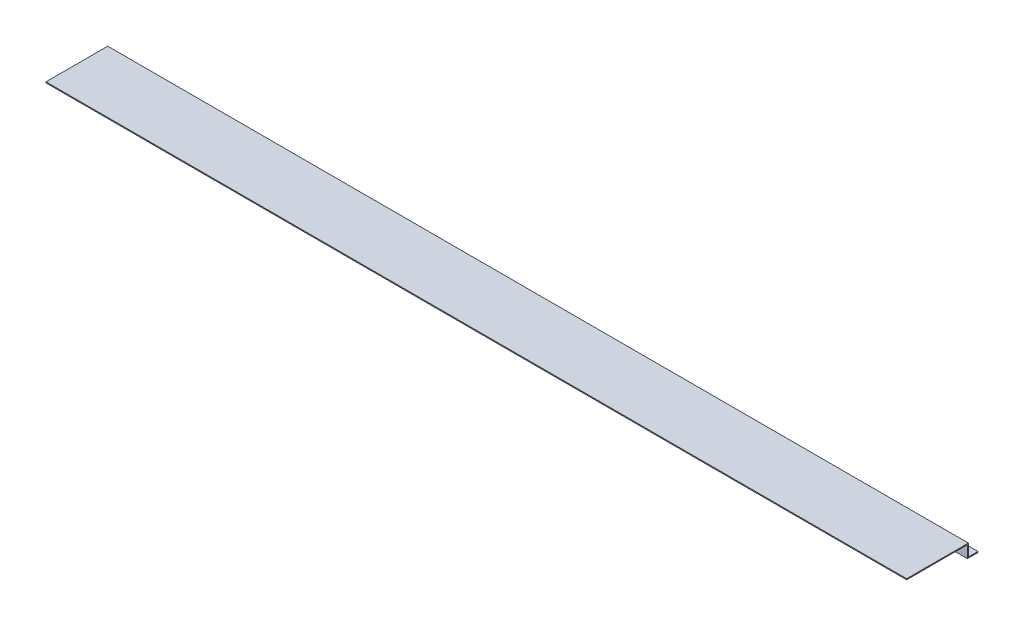
ISO-10303-21;
HEADER;
FILE_DESCRIPTION(('STEP AP214'),'2;1');
FILE_NAME('part.step','',(''),(''),'','','');
FILE_SCHEMA(('AUTOMOTIVE_DESIGN { 1 0 10303 214 1 1 1 1 }'));
ENDSEC;
DATA;
#1=APPLICATION_CONTEXT('core data for automotive mechanical design processes');
#2=APPLICATION_PROTOCOL_DEFINITION('international standard','automotive_design',2000,#1);
#3=PRODUCT_CONTEXT('',#1,'mechanical');
#4=PRODUCT('Part','Part','',(#3));
#5=PRODUCT_RELATED_PRODUCT_CATEGORY('part','',(#4));
#6=PRODUCT_DEFINITION_FORMATION('','',#4);
#7=PRODUCT_DEFINITION_CONTEXT('part definition',#1,'design');
#8=PRODUCT_DEFINITION('design','',#6,#7);
#9=PRODUCT_DEFINITION_SHAPE('','',#8);
#10=(LENGTH_UNIT() NAMED_UNIT(*) SI_UNIT(.MILLI.,.METRE.));
#11=(NAMED_UNIT(*) PLANE_ANGLE_UNIT() SI_UNIT($,.RADIAN.));
#12=(NAMED_UNIT(*) SI_UNIT($,.STERADIAN.) SOLID_ANGLE_UNIT());
#13=UNCERTAINTY_MEASURE_WITH_UNIT(LENGTH_MEASURE(1.E-05),#10,'distance_accuracy_value','');
#14=(GEOMETRIC_REPRESENTATION_CONTEXT(3) GLOBAL_UNCERTAINTY_ASSIGNED_CONTEXT((#13)) GLOBAL_UNIT_ASSIGNED_CONTEXT((#10,
#11,#12)) REPRESENTATION_CONTEXT('',''));
#15=CARTESIAN_POINT('',(0.,0.,0.));
#16=DIRECTION('',(0.,0.,1.));
#17=DIRECTION('',(1.,0.,0.));
#18=AXIS2_PLACEMENT_3D('',#15,#16,#17);
#19=CARTESIAN_POINT('',(1785.,0.,0.));
#20=DIRECTION('',(0.,0.,-1.));
#21=DIRECTION('',(-1.,0.,0.));
#22=AXIS2_PLACEMENT_3D('',#19,#20,#21);
#23=PLANE('',#22);
#24=DIRECTION('',(0.,-1.,0.));
#25=VECTOR('',#24,1.);
#26=CARTESIAN_POINT('',(0.,0.,0.));
#27=LINE('',#26,#25);
#28=CARTESIAN_POINT('',(0.,0.,0.));
#29=VERTEX_POINT('',#28);
#30=CARTESIAN_POINT('',(0.,-2.,0.));
#31=VERTEX_POINT('',#30);
#32=EDGE_CURVE('E134',#29,#31,#27,.T.);
#33=ORIENTED_EDGE('',*,*,#32,.T.);
#34=DIRECTION('',(-1.,0.,0.));
#35=VECTOR('',#34,1.);
#36=CARTESIAN_POINT('',(1785.,-2.,0.));
#37=LINE('',#36,#35);
#38=CARTESIAN_POINT('',(1785.,-2.,0.));
#39=VERTEX_POINT('',#38);
#40=EDGE_CURVE('E11',#39,#31,#37,.T.);
#41=ORIENTED_EDGE('',*,*,#40,.F.);
#42=DIRECTION('',(0.,-1.,0.));
#43=VECTOR('',#42,1.);
#44=CARTESIAN_POINT('',(1785.,0.,0.));
#45=LINE('',#44,#43);
#46=CARTESIAN_POINT('',(1785.,0.,0.));
#47=VERTEX_POINT('',#46);
#48=EDGE_CURVE('E148',#47,#39,#45,.T.);
#49=ORIENTED_EDGE('',*,*,#48,.F.);
#50=DIRECTION('',(-1.,0.,0.));
#51=VECTOR('',#50,1.);
#52=CARTESIAN_POINT('',(1785.,0.,0.));
#53=LINE('',#52,#51);
#54=EDGE_CURVE('E130',#47,#29,#53,.T.);
#55=ORIENTED_EDGE('',*,*,#54,.T.);
#56=EDGE_LOOP('',(#33,#41,#49,#55));
#57=FACE_BOUND('',#56,.T.);
#58=ADVANCED_FACE('F38',(#57),#23,.F.);
#59=CARTESIAN_POINT('',(1785.,-2.,0.));
#60=DIRECTION('',(0.,1.,0.));
#61=DIRECTION('',(0.,0.,1.));
#62=AXIS2_PLACEMENT_3D('',#59,#60,#61);
#63=PLANE('',#62);
#64=DIRECTION('',(0.,0.,-1.));
#65=VECTOR('',#64,1.);
#66=CARTESIAN_POINT('',(0.,-2.,0.));
#67=LINE('',#66,#65);
#68=CARTESIAN_POINT('',(0.,-2.,-126.));
#69=VERTEX_POINT('',#68);
#70=EDGE_CURVE('E137',#31,#69,#67,.T.);
#71=ORIENTED_EDGE('',*,*,#70,.T.);
#72=DIRECTION('',(-1.,0.,0.));
#73=VECTOR('',#72,1.);
#74=CARTESIAN_POINT('',(1785.,-2.,-126.));
#75=LINE('',#74,#73);
#76=CARTESIAN_POINT('',(1785.,-2.,-126.));
#77=VERTEX_POINT('',#76);
#78=EDGE_CURVE('E46',#77,#69,#75,.T.);
#79=ORIENTED_EDGE('',*,*,#78,.F.);
#80=DIRECTION('',(0.,0.,-1.));
#81=VECTOR('',#80,1.);
#82=CARTESIAN_POINT('',(1785.,-2.,0.));
#83=LINE('',#82,#81);
#84=EDGE_CURVE('E97',#39,#77,#83,.T.);
#85=ORIENTED_EDGE('',*,*,#84,.F.);
#86=ORIENTED_EDGE('',*,*,#40,.T.);
#87=EDGE_LOOP('',(#71,#79,#85,#86));
#88=FACE_BOUND('',#87,.T.);
#89=ADVANCED_FACE('F183',(#88),#63,.F.);
#90=CARTESIAN_POINT('',(1785.,-2.,-126.));
#91=DIRECTION('',(0.,0.,-1.));
#92=DIRECTION('',(-1.,0.,0.));
#93=AXIS2_PLACEMENT_3D('',#90,#91,#92);
#94=PLANE('',#93);
#95=DIRECTION('',(0.,-1.,0.));
#96=VECTOR('',#95,1.);
#97=CARTESIAN_POINT('',(0.,-2.,-126.));
#98=LINE('',#97,#96);
#99=CARTESIAN_POINT('',(0.,-27.,-126.));
#100=VERTEX_POINT('',#99);
#101=EDGE_CURVE('E139',#69,#100,#98,.T.);
#102=ORIENTED_EDGE('',*,*,#101,.T.);
#103=DIRECTION('',(-1.,0.,0.));
#104=VECTOR('',#103,1.);
#105=CARTESIAN_POINT('',(1785.,-27.,-126.));
#106=LINE('',#105,#104);
#107=CARTESIAN_POINT('',(1785.,-27.,-126.));
#108=VERTEX_POINT('',#107);
#109=EDGE_CURVE('E155',#108,#100,#106,.T.);
#110=ORIENTED_EDGE('',*,*,#109,.F.);
#111=DIRECTION('',(0.,-1.,0.));
#112=VECTOR('',#111,1.);
#113=CARTESIAN_POINT('',(1785.,-2.,-126.));
#114=LINE('',#113,#112);
#115=EDGE_CURVE('E163',#77,#108,#114,.T.);
#116=ORIENTED_EDGE('',*,*,#115,.F.);
#117=ORIENTED_EDGE('',*,*,#78,.T.);
#118=EDGE_LOOP('',(#102,#110,#116,#117));
#119=FACE_BOUND('',#118,.T.);
#120=ADVANCED_FACE('F161',(#119),#94,.F.);
#121=CARTESIAN_POINT('',(1785.,-27.,-126.));
#122=DIRECTION('',(0.,1.,0.));
#123=DIRECTION('',(0.,0.,1.));
#124=AXIS2_PLACEMENT_3D('',#121,#122,#123);
#125=PLANE('',#124);
#126=DIRECTION('',(0.,0.,-1.));
#127=VECTOR('',#126,1.);
#128=CARTESIAN_POINT('',(0.,-27.,-126.));
#129=LINE('',#128,#127);
#130=CARTESIAN_POINT('',(0.,-27.,-148.));
#131=VERTEX_POINT('',#130);
#132=EDGE_CURVE('E141',#100,#131,#129,.T.);
#133=ORIENTED_EDGE('',*,*,#132,.T.);
#134=DIRECTION('',(-1.,0.,0.));
#135=VECTOR('',#134,1.);
#136=CARTESIAN_POINT('',(1785.,-27.,-148.));
#137=LINE('',#136,#135);
#138=CARTESIAN_POINT('',(1785.,-27.,-148.));
#139=VERTEX_POINT('',#138);
#140=EDGE_CURVE('E152',#139,#131,#137,.T.);
#141=ORIENTED_EDGE('',*,*,#140,.F.);
#142=DIRECTION('',(0.,0.,-1.));
#143=VECTOR('',#142,1.);
#144=CARTESIAN_POINT('',(1785.,-27.,-126.));
#145=LINE('',#144,#143);
#146=EDGE_CURVE('E175',#108,#139,#145,.T.);
#147=ORIENTED_EDGE('',*,*,#146,.F.);
#148=ORIENTED_EDGE('',*,*,#109,.T.);
#149=EDGE_LOOP('',(#133,#141,#147,#148));
#150=FACE_BOUND('',#149,.T.);
#151=ADVANCED_FACE('F171',(#150),#125,.F.);
#152=CARTESIAN_POINT('',(1785.,-25.,-148.));
#153=DIRECTION('',(0.,0.,1.));
#154=DIRECTION('',(1.,0.,0.));
#155=AXIS2_PLACEMENT_3D('',#152,#153,#154);
#156=PLANE('',#155);
#157=DIRECTION('',(0.,1.,0.));
#158=VECTOR('',#157,1.);
#159=CARTESIAN_POINT('',(0.,-25.,-148.));
#160=LINE('',#159,#158);
#161=CARTESIAN_POINT('',(0.,-25.,-148.));
#162=VERTEX_POINT('',#161);
#163=EDGE_CURVE('E143',#131,#162,#160,.T.);
#164=ORIENTED_EDGE('',*,*,#163,.T.);
#165=DIRECTION('',(-1.,0.,0.));
#166=VECTOR('',#165,1.);
#167=CARTESIAN_POINT('',(1785.,-25.,-148.));
#168=LINE('',#167,#166);
#169=CARTESIAN_POINT('',(1785.,-25.,-148.));
#170=VERTEX_POINT('',#169);
#171=EDGE_CURVE('E125',#170,#162,#168,.T.);
#172=ORIENTED_EDGE('',*,*,#171,.F.);
#173=DIRECTION('',(0.,1.,0.));
#174=VECTOR('',#173,1.);
#175=CARTESIAN_POINT('',(1785.,-25.,-148.));
#176=LINE('',#175,#174);
#177=EDGE_CURVE('E116',#139,#170,#176,.T.);
#178=ORIENTED_EDGE('',*,*,#177,.F.);
#179=ORIENTED_EDGE('',*,*,#140,.T.);
#180=EDGE_LOOP('',(#164,#172,#178,#179));
#181=FACE_BOUND('',#180,.T.);
#182=ADVANCED_FACE('F174',(#181),#156,.F.);
#183=CARTESIAN_POINT('',(1785.,-25.,-128.));
#184=DIRECTION('',(0.,-1.,0.));
#185=DIRECTION('',(0.,0.,-1.));
#186=AXIS2_PLACEMENT_3D('',#183,#184,#185);
#187=PLANE('',#186);
#188=DIRECTION('',(0.,0.,1.));
#189=VECTOR('',#188,1.);
#190=CARTESIAN_POINT('',(0.,-25.,-128.));
#191=LINE('',#190,#189);
#192=CARTESIAN_POINT('',(0.,-25.,-128.));
#193=VERTEX_POINT('',#192);
#194=EDGE_CURVE('E124',#162,#193,#191,.T.);
#195=ORIENTED_EDGE('',*,*,#194,.T.);
#196=DIRECTION('',(-1.,0.,0.));
#197=VECTOR('',#196,1.);
#198=CARTESIAN_POINT('',(1785.,-25.,-128.));
#199=LINE('',#198,#197);
#200=CARTESIAN_POINT('',(1785.,-25.,-128.));
#201=VERTEX_POINT('',#200);
#202=EDGE_CURVE('E121',#201,#193,#199,.T.);
#203=ORIENTED_EDGE('',*,*,#202,.F.);
#204=DIRECTION('',(0.,0.,1.));
#205=VECTOR('',#204,1.);
#206=CARTESIAN_POINT('',(1785.,-25.,-128.));
#207=LINE('',#206,#205);
#208=EDGE_CURVE('E110',#170,#201,#207,.T.);
#209=ORIENTED_EDGE('',*,*,#208,.F.);
#210=ORIENTED_EDGE('',*,*,#171,.T.);
#211=EDGE_LOOP('',(#195,#203,#209,#210));
#212=FACE_BOUND('',#211,.T.);
#213=ADVANCED_FACE('F122',(#212),#187,.F.);
#214=CARTESIAN_POINT('',(1785.,0.,-128.));
#215=DIRECTION('',(0.,0.,1.));
#216=DIRECTION('',(1.,0.,0.));
#217=AXIS2_PLACEMENT_3D('',#214,#215,#216);
#218=PLANE('',#217);
#219=DIRECTION('',(0.,1.,0.));
#220=VECTOR('',#219,1.);
#221=CARTESIAN_POINT('',(0.,0.,-128.));
#222=LINE('',#221,#220);
#223=CARTESIAN_POINT('',(0.,0.,-128.));
#224=VERTEX_POINT('',#223);
#225=EDGE_CURVE('E83',#193,#224,#222,.T.);
#226=ORIENTED_EDGE('',*,*,#225,.T.);
#227=DIRECTION('',(-1.,0.,0.));
#228=VECTOR('',#227,1.);
#229=CARTESIAN_POINT('',(1785.,0.,-128.));
#230=LINE('',#229,#228);
#231=CARTESIAN_POINT('',(1785.,0.,-128.));
#232=VERTEX_POINT('',#231);
#233=EDGE_CURVE('E126',#232,#224,#230,.T.);
#234=ORIENTED_EDGE('',*,*,#233,.F.);
#235=DIRECTION('',(0.,1.,0.));
#236=VECTOR('',#235,1.);
#237=CARTESIAN_POINT('',(1785.,0.,-128.));
#238=LINE('',#237,#236);
#239=EDGE_CURVE('E114',#201,#232,#238,.T.);
#240=ORIENTED_EDGE('',*,*,#239,.F.);
#241=ORIENTED_EDGE('',*,*,#202,.T.);
#242=EDGE_LOOP('',(#226,#234,#240,#241));
#243=FACE_BOUND('',#242,.T.);
#244=ADVANCED_FACE('F128',(#243),#218,.F.);
#245=CARTESIAN_POINT('',(1785.,0.,0.));
#246=DIRECTION('',(0.,-1.,0.));
#247=DIRECTION('',(0.,0.,-1.));
#248=AXIS2_PLACEMENT_3D('',#245,#246,#247);
#249=PLANE('',#248);
#250=DIRECTION('',(0.,0.,1.));
#251=VECTOR('',#250,1.);
#252=CARTESIAN_POINT('',(0.,0.,0.));
#253=LINE('',#252,#251);
#254=EDGE_CURVE('E89',#224,#29,#253,.T.);
#255=ORIENTED_EDGE('',*,*,#254,.T.);
#256=ORIENTED_EDGE('',*,*,#54,.F.);
#257=DIRECTION('',(0.,0.,1.));
#258=VECTOR('',#257,1.);
#259=CARTESIAN_POINT('',(1785.,0.,0.));
#260=LINE('',#259,#258);
#261=EDGE_CURVE('E54',#232,#47,#260,.T.);
#262=ORIENTED_EDGE('',*,*,#261,.F.);
#263=ORIENTED_EDGE('',*,*,#233,.T.);
#264=EDGE_LOOP('',(#255,#256,#262,#263));
#265=FACE_BOUND('',#264,.T.);
#266=ADVANCED_FACE('F199',(#265),#249,.F.);
#267=CARTESIAN_POINT('',(1785.,0.,0.));
#268=DIRECTION('',(1.,0.,0.));
#269=DIRECTION('',(0.,0.,-1.));
#270=AXIS2_PLACEMENT_3D('',#267,#268,#269);
#271=PLANE('',#270);
#272=ORIENTED_EDGE('',*,*,#48,.T.);
#273=ORIENTED_EDGE('',*,*,#84,.T.);
#274=ORIENTED_EDGE('',*,*,#115,.T.);
#275=ORIENTED_EDGE('',*,*,#146,.T.);
#276=ORIENTED_EDGE('',*,*,#177,.T.);
#277=ORIENTED_EDGE('',*,*,#208,.T.);
#278=ORIENTED_EDGE('',*,*,#239,.T.);
#279=ORIENTED_EDGE('',*,*,#261,.T.);
#280=EDGE_LOOP('',(#272,#273,#274,#275,#276,#277,#278,#279));
#281=FACE_BOUND('',#280,.T.);
#282=ADVANCED_FACE('F112',(#281),#271,.T.);
#283=CARTESIAN_POINT('',(0.,0.,0.));
#284=DIRECTION('',(1.,0.,0.));
#285=DIRECTION('',(0.,0.,-1.));
#286=AXIS2_PLACEMENT_3D('',#283,#284,#285);
#287=PLANE('',#286);
#288=ORIENTED_EDGE('',*,*,#32,.F.);
#289=ORIENTED_EDGE('',*,*,#254,.F.);
#290=ORIENTED_EDGE('',*,*,#225,.F.);
#291=ORIENTED_EDGE('',*,*,#194,.F.);
#292=ORIENTED_EDGE('',*,*,#163,.F.);
#293=ORIENTED_EDGE('',*,*,#132,.F.);
#294=ORIENTED_EDGE('',*,*,#101,.F.);
#295=ORIENTED_EDGE('',*,*,#70,.F.);
#296=EDGE_LOOP('',(#288,#289,#290,#291,#292,#293,#294,#295));
#297=FACE_BOUND('',#296,.T.);
#298=ADVANCED_FACE('F167',(#297),#287,.F.);
#299=CLOSED_SHELL('',(#58,#89,#120,#151,#182,#213,#244,#266,#282,#298));
#300=MANIFOLD_SOLID_BREP('B2',#299);
#301=ADVANCED_BREP_SHAPE_REPRESENTATION('',(#18,#300),#14);
#302=SHAPE_DEFINITION_REPRESENTATION(#9,#301);
ENDSEC;
END-ISO-10303-21;
